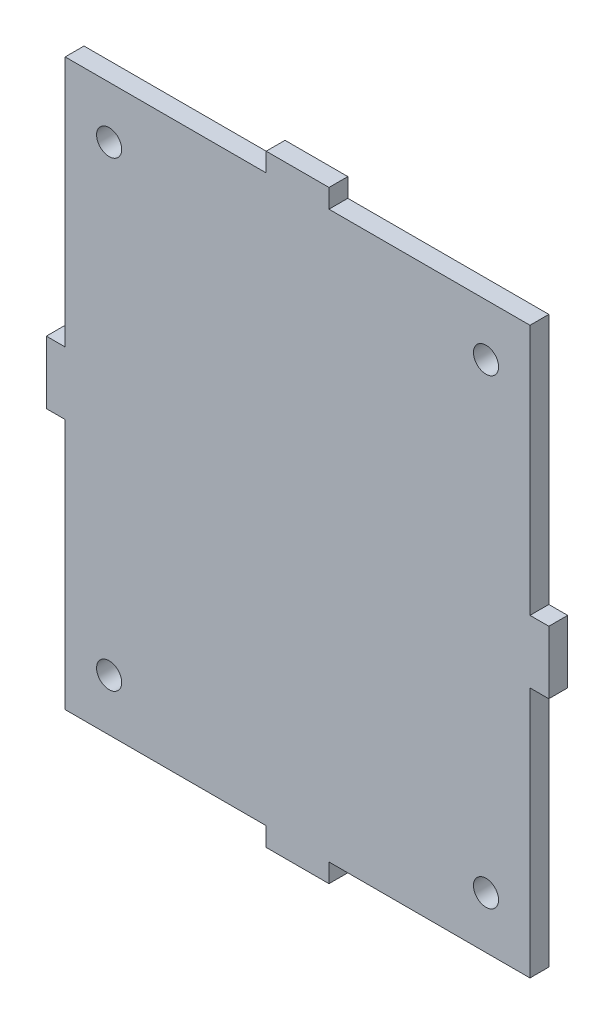
ISO-10303-21;
HEADER;
FILE_DESCRIPTION(('STEP AP214'),'2;1');
FILE_NAME('part.step','',(''),(''),'','','');
FILE_SCHEMA(('AUTOMOTIVE_DESIGN { 1 0 10303 214 1 1 1 1 }'));
ENDSEC;
DATA;
#1=APPLICATION_CONTEXT('core data for automotive mechanical design processes');
#2=APPLICATION_PROTOCOL_DEFINITION('international standard','automotive_design',2000,#1);
#3=PRODUCT_CONTEXT('',#1,'mechanical');
#4=PRODUCT('Part','Part','',(#3));
#5=PRODUCT_RELATED_PRODUCT_CATEGORY('part','',(#4));
#6=PRODUCT_DEFINITION_FORMATION('','',#4);
#7=PRODUCT_DEFINITION_CONTEXT('part definition',#1,'design');
#8=PRODUCT_DEFINITION('design','',#6,#7);
#9=PRODUCT_DEFINITION_SHAPE('','',#8);
#10=(LENGTH_UNIT() NAMED_UNIT(*) SI_UNIT(.MILLI.,.METRE.));
#11=(NAMED_UNIT(*) PLANE_ANGLE_UNIT() SI_UNIT($,.RADIAN.));
#12=(NAMED_UNIT(*) SI_UNIT($,.STERADIAN.) SOLID_ANGLE_UNIT());
#13=UNCERTAINTY_MEASURE_WITH_UNIT(LENGTH_MEASURE(1.E-05),#10,'distance_accuracy_value','');
#14=(GEOMETRIC_REPRESENTATION_CONTEXT(3) GLOBAL_UNCERTAINTY_ASSIGNED_CONTEXT((#13)) GLOBAL_UNIT_ASSIGNED_CONTEXT((#10,
#11,#12)) REPRESENTATION_CONTEXT('',''));
#15=CARTESIAN_POINT('',(0.,0.,0.));
#16=DIRECTION('',(0.,0.,1.));
#17=DIRECTION('',(1.,0.,0.));
#18=AXIS2_PLACEMENT_3D('',#15,#16,#17);
#19=CARTESIAN_POINT('',(-37.,-41.75,3.));
#20=DIRECTION('',(1.,0.,0.));
#21=DIRECTION('',(0.,0.,-1.));
#22=AXIS2_PLACEMENT_3D('',#19,#20,#21);
#23=PLANE('',#22);
#24=DIRECTION('',(0.,0.,1.));
#25=VECTOR('',#24,1.);
#26=CARTESIAN_POINT('',(-36.9999999999999,-41.75,-10.4403065089106));
#27=LINE('',#26,#25);
#28=CARTESIAN_POINT('',(-36.9999999999999,-41.75,0.));
#29=VERTEX_POINT('',#28);
#30=CARTESIAN_POINT('',(-36.9999999999999,-41.75,3.));
#31=VERTEX_POINT('',#30);
#32=EDGE_CURVE('E179',#29,#31,#27,.T.);
#33=ORIENTED_EDGE('',*,*,#32,.F.);
#34=DIRECTION('',(0.,-1.,0.));
#35=VECTOR('',#34,1.);
#36=CARTESIAN_POINT('',(-37.,-41.75,0.));
#37=LINE('',#36,#35);
#38=CARTESIAN_POINT('',(-37.,-81.75,0.));
#39=VERTEX_POINT('',#38);
#40=EDGE_CURVE('E189',#29,#39,#37,.T.);
#41=ORIENTED_EDGE('',*,*,#40,.T.);
#42=DIRECTION('',(0.,0.,-1.));
#43=VECTOR('',#42,1.);
#44=CARTESIAN_POINT('',(-37.,-81.75,3.));
#45=LINE('',#44,#43);
#46=CARTESIAN_POINT('',(-37.,-81.75,3.));
#47=VERTEX_POINT('',#46);
#48=EDGE_CURVE('E11',#47,#39,#45,.T.);
#49=ORIENTED_EDGE('',*,*,#48,.F.);
#50=DIRECTION('',(0.,-1.,0.));
#51=VECTOR('',#50,1.);
#52=CARTESIAN_POINT('',(-37.,-41.75,3.));
#53=LINE('',#52,#51);
#54=EDGE_CURVE('E190',#31,#47,#53,.T.);
#55=ORIENTED_EDGE('',*,*,#54,.F.);
#56=EDGE_LOOP('',(#33,#41,#49,#55));
#57=FACE_BOUND('',#56,.T.);
#58=ADVANCED_FACE('F37',(#57),#23,.F.);
#59=CARTESIAN_POINT('',(37.,-41.75,3.));
#60=DIRECTION('',(-1.,0.,0.));
#61=DIRECTION('',(0.,0.,1.));
#62=AXIS2_PLACEMENT_3D('',#59,#60,#61);
#63=PLANE('',#62);
#64=DIRECTION('',(0.,0.,1.));
#65=VECTOR('',#64,1.);
#66=CARTESIAN_POINT('',(36.9999999999999,-31.75,-10.4403065089106));
#67=LINE('',#66,#65);
#68=CARTESIAN_POINT('',(36.9999999999999,-31.75,0.));
#69=VERTEX_POINT('',#68);
#70=CARTESIAN_POINT('',(36.9999999999999,-31.75,3.));
#71=VERTEX_POINT('',#70);
#72=EDGE_CURVE('E332',#69,#71,#67,.T.);
#73=ORIENTED_EDGE('',*,*,#72,.F.);
#74=DIRECTION('',(0.,1.,0.));
#75=VECTOR('',#74,1.);
#76=CARTESIAN_POINT('',(37.,-41.75,0.));
#77=LINE('',#76,#75);
#78=CARTESIAN_POINT('',(37.,8.24999999999999,0.));
#79=VERTEX_POINT('',#78);
#80=EDGE_CURVE('E216',#69,#79,#77,.T.);
#81=ORIENTED_EDGE('',*,*,#80,.T.);
#82=DIRECTION('',(0.,0.,-1.));
#83=VECTOR('',#82,1.);
#84=CARTESIAN_POINT('',(37.,8.24999999999999,3.));
#85=LINE('',#84,#83);
#86=CARTESIAN_POINT('',(37.,8.24999999999999,3.));
#87=VERTEX_POINT('',#86);
#88=EDGE_CURVE('E45',#87,#79,#85,.T.);
#89=ORIENTED_EDGE('',*,*,#88,.F.);
#90=DIRECTION('',(0.,1.,0.));
#91=VECTOR('',#90,1.);
#92=CARTESIAN_POINT('',(37.,-41.75,3.));
#93=LINE('',#92,#91);
#94=EDGE_CURVE('E286',#71,#87,#93,.T.);
#95=ORIENTED_EDGE('',*,*,#94,.F.);
#96=EDGE_LOOP('',(#73,#81,#89,#95));
#97=FACE_BOUND('',#96,.T.);
#98=ADVANCED_FACE('F418',(#97),#63,.F.);
#99=CARTESIAN_POINT('',(0.,0.,3.));
#100=DIRECTION('',(0.,0.,-1.));
#101=DIRECTION('',(-1.,0.,0.));
#102=AXIS2_PLACEMENT_3D('',#99,#100,#101);
#103=PLANE('',#102);
#104=DIRECTION('',(1.,0.,0.));
#105=VECTOR('',#104,1.);
#106=CARTESIAN_POINT('',(5.,-81.75,3.));
#107=LINE('',#106,#105);
#108=CARTESIAN_POINT('',(5.,-81.75,3.));
#109=VERTEX_POINT('',#108);
#110=CARTESIAN_POINT('',(37.,-81.75,3.));
#111=VERTEX_POINT('',#110);
#112=EDGE_CURVE('E287',#109,#111,#107,.T.);
#113=ORIENTED_EDGE('',*,*,#112,.T.);
#114=CARTESIAN_POINT('',(37.,-41.75,3.));
#115=VERTEX_POINT('',#114);
#116=EDGE_CURVE('E283',#111,#115,#93,.T.);
#117=ORIENTED_EDGE('',*,*,#116,.T.);
#118=DIRECTION('',(1.,0.,0.));
#119=VECTOR('',#118,1.);
#120=CARTESIAN_POINT('',(39.9999999999999,-41.75,3.));
#121=LINE('',#120,#119);
#122=CARTESIAN_POINT('',(39.9999999999999,-41.75,3.));
#123=VERTEX_POINT('',#122);
#124=EDGE_CURVE('E60',#115,#123,#121,.T.);
#125=ORIENTED_EDGE('',*,*,#124,.T.);
#126=DIRECTION('',(0.,1.,0.));
#127=VECTOR('',#126,1.);
#128=CARTESIAN_POINT('',(39.9999999999999,-31.75,3.));
#129=LINE('',#128,#127);
#130=CARTESIAN_POINT('',(39.9999999999999,-31.75,3.));
#131=VERTEX_POINT('',#130);
#132=EDGE_CURVE('E338',#123,#131,#129,.T.);
#133=ORIENTED_EDGE('',*,*,#132,.T.);
#134=DIRECTION('',(-1.,0.,0.));
#135=VECTOR('',#134,1.);
#136=CARTESIAN_POINT('',(39.9999999999999,-31.75,3.));
#137=LINE('',#136,#135);
#138=EDGE_CURVE('E349',#131,#71,#137,.T.);
#139=ORIENTED_EDGE('',*,*,#138,.T.);
#140=ORIENTED_EDGE('',*,*,#94,.T.);
#141=DIRECTION('',(-1.,0.,0.));
#142=VECTOR('',#141,1.);
#143=CARTESIAN_POINT('',(5.,8.24999999999999,3.));
#144=LINE('',#143,#142);
#145=CARTESIAN_POINT('',(5.,8.24999999999999,3.));
#146=VERTEX_POINT('',#145);
#147=EDGE_CURVE('E260',#87,#146,#144,.T.);
#148=ORIENTED_EDGE('',*,*,#147,.T.);
#149=DIRECTION('',(0.,1.,0.));
#150=VECTOR('',#149,1.);
#151=CARTESIAN_POINT('',(5.,11.25,3.));
#152=LINE('',#151,#150);
#153=CARTESIAN_POINT('',(5.,11.25,3.));
#154=VERTEX_POINT('',#153);
#155=EDGE_CURVE('E278',#146,#154,#152,.T.);
#156=ORIENTED_EDGE('',*,*,#155,.T.);
#157=DIRECTION('',(-1.,0.,0.));
#158=VECTOR('',#157,1.);
#159=CARTESIAN_POINT('',(-5.,11.25,3.));
#160=LINE('',#159,#158);
#161=CARTESIAN_POINT('',(-5.,11.25,3.));
#162=VERTEX_POINT('',#161);
#163=EDGE_CURVE('E275',#154,#162,#160,.T.);
#164=ORIENTED_EDGE('',*,*,#163,.T.);
#165=DIRECTION('',(0.,-1.,0.));
#166=VECTOR('',#165,1.);
#167=CARTESIAN_POINT('',(-5.,11.25,3.));
#168=LINE('',#167,#166);
#169=CARTESIAN_POINT('',(-5.,8.24999999999999,3.));
#170=VERTEX_POINT('',#169);
#171=EDGE_CURVE('E233',#162,#170,#168,.T.);
#172=ORIENTED_EDGE('',*,*,#171,.T.);
#173=DIRECTION('',(-1.,0.,0.));
#174=VECTOR('',#173,1.);
#175=CARTESIAN_POINT('',(-40.,8.24999999999999,3.));
#176=LINE('',#175,#174);
#177=CARTESIAN_POINT('',(-37.,8.24999999999999,3.));
#178=VERTEX_POINT('',#177);
#179=EDGE_CURVE('E228',#170,#178,#176,.T.);
#180=ORIENTED_EDGE('',*,*,#179,.T.);
#181=CARTESIAN_POINT('',(-37.,-31.75,3.));
#182=VERTEX_POINT('',#181);
#183=EDGE_CURVE('E298',#178,#182,#53,.T.);
#184=ORIENTED_EDGE('',*,*,#183,.T.);
#185=DIRECTION('',(-1.,0.,0.));
#186=VECTOR('',#185,1.);
#187=CARTESIAN_POINT('',(-39.9999999999999,-31.75,3.));
#188=LINE('',#187,#186);
#189=CARTESIAN_POINT('',(-39.9999999999999,-31.75,3.));
#190=VERTEX_POINT('',#189);
#191=EDGE_CURVE('E52',#182,#190,#188,.T.);
#192=ORIENTED_EDGE('',*,*,#191,.T.);
#193=DIRECTION('',(0.,-1.,0.));
#194=VECTOR('',#193,1.);
#195=CARTESIAN_POINT('',(-39.9999999999999,-31.75,3.));
#196=LINE('',#195,#194);
#197=CARTESIAN_POINT('',(-39.9999999999999,-41.75,3.));
#198=VERTEX_POINT('',#197);
#199=EDGE_CURVE('E356',#190,#198,#196,.T.);
#200=ORIENTED_EDGE('',*,*,#199,.T.);
#201=DIRECTION('',(1.,0.,0.));
#202=VECTOR('',#201,1.);
#203=CARTESIAN_POINT('',(-39.9999999999999,-41.75,3.));
#204=LINE('',#203,#202);
#205=EDGE_CURVE('E352',#198,#31,#204,.T.);
#206=ORIENTED_EDGE('',*,*,#205,.T.);
#207=ORIENTED_EDGE('',*,*,#54,.T.);
#208=DIRECTION('',(1.,0.,0.));
#209=VECTOR('',#208,1.);
#210=CARTESIAN_POINT('',(-40.,-81.75,3.));
#211=LINE('',#210,#209);
#212=CARTESIAN_POINT('',(-5.,-81.75,3.));
#213=VERTEX_POINT('',#212);
#214=EDGE_CURVE('E296',#47,#213,#211,.T.);
#215=ORIENTED_EDGE('',*,*,#214,.T.);
#216=DIRECTION('',(0.,-1.,0.));
#217=VECTOR('',#216,1.);
#218=CARTESIAN_POINT('',(-5.,-84.75,3.));
#219=LINE('',#218,#217);
#220=CARTESIAN_POINT('',(-5.,-84.75,3.));
#221=VERTEX_POINT('',#220);
#222=EDGE_CURVE('E294',#213,#221,#219,.T.);
#223=ORIENTED_EDGE('',*,*,#222,.T.);
#224=DIRECTION('',(1.,0.,0.));
#225=VECTOR('',#224,1.);
#226=CARTESIAN_POINT('',(-5.,-84.75,3.));
#227=LINE('',#226,#225);
#228=CARTESIAN_POINT('',(5.,-84.75,3.));
#229=VERTEX_POINT('',#228);
#230=EDGE_CURVE('E292',#221,#229,#227,.T.);
#231=ORIENTED_EDGE('',*,*,#230,.T.);
#232=DIRECTION('',(0.,1.,0.));
#233=VECTOR('',#232,1.);
#234=CARTESIAN_POINT('',(5.,-84.75,3.));
#235=LINE('',#234,#233);
#236=EDGE_CURVE('E290',#229,#109,#235,.T.);
#237=ORIENTED_EDGE('',*,*,#236,.T.);
#238=EDGE_LOOP('',(#113,#117,#125,#133,#139,#140,#148,#156,#164,#172,#180,#184,#192,#200,#206,
#207,#215,#223,#231,#237));
#239=FACE_BOUND('',#238,.T.);
#240=CARTESIAN_POINT('',(30.,0.,3.));
#241=DIRECTION('',(0.,0.,1.));
#242=DIRECTION('',(1.,0.,0.));
#243=AXIS2_PLACEMENT_3D('',#240,#241,#242);
#244=CIRCLE('',#243,2.);
#245=CARTESIAN_POINT('',(32.,0.,3.));
#246=VERTEX_POINT('',#245);
#247=EDGE_CURVE('E202',#246,#246,#244,.T.);
#248=ORIENTED_EDGE('',*,*,#247,.F.);
#249=EDGE_LOOP('',(#248));
#250=FACE_BOUND('',#249,.T.);
#251=CARTESIAN_POINT('',(30.,-73.5,3.));
#252=DIRECTION('',(0.,0.,1.));
#253=DIRECTION('',(-1.,0.,0.));
#254=AXIS2_PLACEMENT_3D('',#251,#252,#253);
#255=CIRCLE('',#254,2.);
#256=CARTESIAN_POINT('',(28.,-73.5,3.));
#257=VERTEX_POINT('',#256);
#258=EDGE_CURVE('E306',#257,#257,#255,.T.);
#259=ORIENTED_EDGE('',*,*,#258,.F.);
#260=EDGE_LOOP('',(#259));
#261=FACE_BOUND('',#260,.T.);
#262=CARTESIAN_POINT('',(-30.,-73.5,3.));
#263=DIRECTION('',(0.,0.,1.));
#264=DIRECTION('',(1.,0.,0.));
#265=AXIS2_PLACEMENT_3D('',#262,#263,#264);
#266=CIRCLE('',#265,2.);
#267=CARTESIAN_POINT('',(-28.,-73.5,3.));
#268=VERTEX_POINT('',#267);
#269=EDGE_CURVE('E312',#268,#268,#266,.T.);
#270=ORIENTED_EDGE('',*,*,#269,.F.);
#271=EDGE_LOOP('',(#270));
#272=FACE_BOUND('',#271,.T.);
#273=CARTESIAN_POINT('',(-30.,0.,3.));
#274=DIRECTION('',(0.,0.,1.));
#275=DIRECTION('',(-1.,0.,0.));
#276=AXIS2_PLACEMENT_3D('',#273,#274,#275);
#277=CIRCLE('',#276,2.);
#278=CARTESIAN_POINT('',(-32.,0.,3.));
#279=VERTEX_POINT('',#278);
#280=EDGE_CURVE('E318',#279,#279,#277,.T.);
#281=ORIENTED_EDGE('',*,*,#280,.F.);
#282=EDGE_LOOP('',(#281));
#283=FACE_BOUND('',#282,.T.);
#284=ADVANCED_FACE('F373',(#239,#250,#261,#272,#283),#103,.F.);
#285=CARTESIAN_POINT('',(0.,0.,0.));
#286=DIRECTION('',(0.,0.,-1.));
#287=DIRECTION('',(-1.,0.,0.));
#288=AXIS2_PLACEMENT_3D('',#285,#286,#287);
#289=PLANE('',#288);
#290=CARTESIAN_POINT('',(37.,-81.75,0.));
#291=VERTEX_POINT('',#290);
#292=CARTESIAN_POINT('',(36.9999999999999,-41.75,0.));
#293=VERTEX_POINT('',#292);
#294=EDGE_CURVE('E217',#291,#293,#77,.T.);
#295=ORIENTED_EDGE('',*,*,#294,.F.);
#296=DIRECTION('',(1.,0.,0.));
#297=VECTOR('',#296,1.);
#298=CARTESIAN_POINT('',(5.,-81.75,0.));
#299=LINE('',#298,#297);
#300=CARTESIAN_POINT('',(5.,-81.75,0.));
#301=VERTEX_POINT('',#300);
#302=EDGE_CURVE('E213',#301,#291,#299,.T.);
#303=ORIENTED_EDGE('',*,*,#302,.F.);
#304=DIRECTION('',(0.,1.,0.));
#305=VECTOR('',#304,1.);
#306=CARTESIAN_POINT('',(5.,-84.75,0.));
#307=LINE('',#306,#305);
#308=CARTESIAN_POINT('',(5.,-84.75,0.));
#309=VERTEX_POINT('',#308);
#310=EDGE_CURVE('E211',#309,#301,#307,.T.);
#311=ORIENTED_EDGE('',*,*,#310,.F.);
#312=DIRECTION('',(1.,0.,0.));
#313=VECTOR('',#312,1.);
#314=CARTESIAN_POINT('',(-5.,-84.75,0.));
#315=LINE('',#314,#313);
#316=CARTESIAN_POINT('',(-5.,-84.75,0.));
#317=VERTEX_POINT('',#316);
#318=EDGE_CURVE('E209',#317,#309,#315,.T.);
#319=ORIENTED_EDGE('',*,*,#318,.F.);
#320=DIRECTION('',(0.,-1.,0.));
#321=VECTOR('',#320,1.);
#322=CARTESIAN_POINT('',(-5.,-84.75,0.));
#323=LINE('',#322,#321);
#324=CARTESIAN_POINT('',(-5.,-81.75,0.));
#325=VERTEX_POINT('',#324);
#326=EDGE_CURVE('E207',#325,#317,#323,.T.);
#327=ORIENTED_EDGE('',*,*,#326,.F.);
#328=DIRECTION('',(1.,0.,0.));
#329=VECTOR('',#328,1.);
#330=CARTESIAN_POINT('',(-40.,-81.75,0.));
#331=LINE('',#330,#329);
#332=EDGE_CURVE('E196',#39,#325,#331,.T.);
#333=ORIENTED_EDGE('',*,*,#332,.F.);
#334=ORIENTED_EDGE('',*,*,#40,.F.);
#335=DIRECTION('',(1.,0.,0.));
#336=VECTOR('',#335,1.);
#337=CARTESIAN_POINT('',(-39.9999999999999,-41.75,0.));
#338=LINE('',#337,#336);
#339=CARTESIAN_POINT('',(-39.9999999999999,-41.75,0.));
#340=VERTEX_POINT('',#339);
#341=EDGE_CURVE('E175',#340,#29,#338,.T.);
#342=ORIENTED_EDGE('',*,*,#341,.F.);
#343=DIRECTION('',(0.,-1.,0.));
#344=VECTOR('',#343,1.);
#345=CARTESIAN_POINT('',(-39.9999999999999,-31.75,0.));
#346=LINE('',#345,#344);
#347=CARTESIAN_POINT('',(-39.9999999999999,-31.75,0.));
#348=VERTEX_POINT('',#347);
#349=EDGE_CURVE('E362',#348,#340,#346,.T.);
#350=ORIENTED_EDGE('',*,*,#349,.F.);
#351=DIRECTION('',(-1.,0.,0.));
#352=VECTOR('',#351,1.);
#353=CARTESIAN_POINT('',(-39.9999999999999,-31.75,0.));
#354=LINE('',#353,#352);
#355=CARTESIAN_POINT('',(-36.9999999999999,-31.75,0.));
#356=VERTEX_POINT('',#355);
#357=EDGE_CURVE('E365',#356,#348,#354,.T.);
#358=ORIENTED_EDGE('',*,*,#357,.F.);
#359=CARTESIAN_POINT('',(-37.,8.24999999999999,0.));
#360=VERTEX_POINT('',#359);
#361=EDGE_CURVE('E197',#360,#356,#37,.T.);
#362=ORIENTED_EDGE('',*,*,#361,.F.);
#363=DIRECTION('',(-1.,0.,0.));
#364=VECTOR('',#363,1.);
#365=CARTESIAN_POINT('',(-40.,8.24999999999999,0.));
#366=LINE('',#365,#364);
#367=CARTESIAN_POINT('',(-5.,8.24999999999999,0.));
#368=VERTEX_POINT('',#367);
#369=EDGE_CURVE('E198',#368,#360,#366,.T.);
#370=ORIENTED_EDGE('',*,*,#369,.F.);
#371=DIRECTION('',(0.,-1.,0.));
#372=VECTOR('',#371,1.);
#373=CARTESIAN_POINT('',(-5.,11.25,0.));
#374=LINE('',#373,#372);
#375=CARTESIAN_POINT('',(-5.,11.25,0.));
#376=VERTEX_POINT('',#375);
#377=EDGE_CURVE('E226',#376,#368,#374,.T.);
#378=ORIENTED_EDGE('',*,*,#377,.F.);
#379=DIRECTION('',(-1.,0.,0.));
#380=VECTOR('',#379,1.);
#381=CARTESIAN_POINT('',(-5.,11.25,0.));
#382=LINE('',#381,#380);
#383=CARTESIAN_POINT('',(5.,11.25,0.));
#384=VERTEX_POINT('',#383);
#385=EDGE_CURVE('E224',#384,#376,#382,.T.);
#386=ORIENTED_EDGE('',*,*,#385,.F.);
#387=DIRECTION('',(0.,1.,0.));
#388=VECTOR('',#387,1.);
#389=CARTESIAN_POINT('',(5.,11.25,0.));
#390=LINE('',#389,#388);
#391=CARTESIAN_POINT('',(5.,8.24999999999999,0.));
#392=VERTEX_POINT('',#391);
#393=EDGE_CURVE('E222',#392,#384,#390,.T.);
#394=ORIENTED_EDGE('',*,*,#393,.F.);
#395=DIRECTION('',(-1.,0.,0.));
#396=VECTOR('',#395,1.);
#397=CARTESIAN_POINT('',(5.,8.24999999999999,0.));
#398=LINE('',#397,#396);
#399=EDGE_CURVE('E220',#79,#392,#398,.T.);
#400=ORIENTED_EDGE('',*,*,#399,.F.);
#401=ORIENTED_EDGE('',*,*,#80,.F.);
#402=DIRECTION('',(-1.,0.,0.));
#403=VECTOR('',#402,1.);
#404=CARTESIAN_POINT('',(39.9999999999999,-31.75,0.));
#405=LINE('',#404,#403);
#406=CARTESIAN_POINT('',(39.9999999999999,-31.75,0.));
#407=VERTEX_POINT('',#406);
#408=EDGE_CURVE('E334',#407,#69,#405,.T.);
#409=ORIENTED_EDGE('',*,*,#408,.F.);
#410=DIRECTION('',(0.,1.,0.));
#411=VECTOR('',#410,1.);
#412=CARTESIAN_POINT('',(39.9999999999999,-31.75,0.));
#413=LINE('',#412,#411);
#414=CARTESIAN_POINT('',(39.9999999999999,-41.75,0.));
#415=VERTEX_POINT('',#414);
#416=EDGE_CURVE('E341',#415,#407,#413,.T.);
#417=ORIENTED_EDGE('',*,*,#416,.F.);
#418=DIRECTION('',(1.,0.,0.));
#419=VECTOR('',#418,1.);
#420=CARTESIAN_POINT('',(39.9999999999999,-41.75,0.));
#421=LINE('',#420,#419);
#422=EDGE_CURVE('E337',#293,#415,#421,.T.);
#423=ORIENTED_EDGE('',*,*,#422,.F.);
#424=EDGE_LOOP('',(#295,#303,#311,#319,#327,#333,#334,#342,#350,#358,#362,#370,#378,#386,#394,
#400,#401,#409,#417,#423));
#425=FACE_BOUND('',#424,.T.);
#426=CARTESIAN_POINT('',(-30.,-73.5,0.));
#427=DIRECTION('',(0.,0.,1.));
#428=DIRECTION('',(1.,0.,0.));
#429=AXIS2_PLACEMENT_3D('',#426,#427,#428);
#430=CIRCLE('',#429,2.);
#431=CARTESIAN_POINT('',(-28.,-73.5,0.));
#432=VERTEX_POINT('',#431);
#433=EDGE_CURVE('E315',#432,#432,#430,.T.);
#434=ORIENTED_EDGE('',*,*,#433,.T.);
#435=EDGE_LOOP('',(#434));
#436=FACE_BOUND('',#435,.T.);
#437=CARTESIAN_POINT('',(30.,0.,0.));
#438=DIRECTION('',(0.,0.,1.));
#439=DIRECTION('',(1.,0.,0.));
#440=AXIS2_PLACEMENT_3D('',#437,#438,#439);
#441=CIRCLE('',#440,2.);
#442=CARTESIAN_POINT('',(32.,0.,0.));
#443=VERTEX_POINT('',#442);
#444=EDGE_CURVE('E303',#443,#443,#441,.T.);
#445=ORIENTED_EDGE('',*,*,#444,.T.);
#446=EDGE_LOOP('',(#445));
#447=FACE_BOUND('',#446,.T.);
#448=CARTESIAN_POINT('',(30.,-73.5,0.));
#449=DIRECTION('',(0.,0.,1.));
#450=DIRECTION('',(-1.,0.,0.));
#451=AXIS2_PLACEMENT_3D('',#448,#449,#450);
#452=CIRCLE('',#451,2.);
#453=CARTESIAN_POINT('',(28.,-73.5,0.));
#454=VERTEX_POINT('',#453);
#455=EDGE_CURVE('E309',#454,#454,#452,.T.);
#456=ORIENTED_EDGE('',*,*,#455,.T.);
#457=EDGE_LOOP('',(#456));
#458=FACE_BOUND('',#457,.T.);
#459=CARTESIAN_POINT('',(-30.,0.,0.));
#460=DIRECTION('',(0.,0.,1.));
#461=DIRECTION('',(-1.,0.,0.));
#462=AXIS2_PLACEMENT_3D('',#459,#460,#461);
#463=CIRCLE('',#462,2.);
#464=CARTESIAN_POINT('',(-32.,0.,0.));
#465=VERTEX_POINT('',#464);
#466=EDGE_CURVE('E321',#465,#465,#463,.T.);
#467=ORIENTED_EDGE('',*,*,#466,.T.);
#468=EDGE_LOOP('',(#467));
#469=FACE_BOUND('',#468,.T.);
#470=ADVANCED_FACE('F193',(#425,#436,#447,#458,#469),#289,.T.);
#471=CARTESIAN_POINT('',(-40.,8.24999999999999,3.));
#472=DIRECTION('',(0.,-1.,0.));
#473=DIRECTION('',(0.,0.,-1.));
#474=AXIS2_PLACEMENT_3D('',#471,#472,#473);
#475=PLANE('',#474);
#476=ORIENTED_EDGE('',*,*,#369,.T.);
#477=DIRECTION('',(0.,0.,1.));
#478=VECTOR('',#477,1.);
#479=CARTESIAN_POINT('',(-37.,8.24999999999999,3.));
#480=LINE('',#479,#478);
#481=EDGE_CURVE('E324',#360,#178,#480,.T.);
#482=ORIENTED_EDGE('',*,*,#481,.T.);
#483=ORIENTED_EDGE('',*,*,#179,.F.);
#484=DIRECTION('',(0.,0.,-1.));
#485=VECTOR('',#484,1.);
#486=CARTESIAN_POINT('',(-5.,8.24999999999999,3.));
#487=LINE('',#486,#485);
#488=EDGE_CURVE('E229',#170,#368,#487,.T.);
#489=ORIENTED_EDGE('',*,*,#488,.T.);
#490=EDGE_LOOP('',(#476,#482,#483,#489));
#491=FACE_BOUND('',#490,.T.);
#492=ADVANCED_FACE('F39',(#491),#475,.F.);
#493=ORIENTED_EDGE('',*,*,#361,.T.);
#494=DIRECTION('',(0.,0.,1.));
#495=VECTOR('',#494,1.);
#496=CARTESIAN_POINT('',(-36.9999999999999,-31.75,-10.4403065089106));
#497=LINE('',#496,#495);
#498=EDGE_CURVE('E359',#356,#182,#497,.T.);
#499=ORIENTED_EDGE('',*,*,#498,.T.);
#500=ORIENTED_EDGE('',*,*,#183,.F.);
#501=ORIENTED_EDGE('',*,*,#481,.F.);
#502=EDGE_LOOP('',(#493,#499,#500,#501));
#503=FACE_BOUND('',#502,.T.);
#504=ADVANCED_FACE('F371',(#503),#23,.F.);
#505=CARTESIAN_POINT('',(-40.,-81.75,3.));
#506=DIRECTION('',(0.,1.,0.));
#507=DIRECTION('',(-1.,0.,0.));
#508=AXIS2_PLACEMENT_3D('',#505,#506,#507);
#509=PLANE('',#508);
#510=ORIENTED_EDGE('',*,*,#214,.F.);
#511=ORIENTED_EDGE('',*,*,#48,.T.);
#512=ORIENTED_EDGE('',*,*,#332,.T.);
#513=DIRECTION('',(0.,0.,-1.));
#514=VECTOR('',#513,1.);
#515=CARTESIAN_POINT('',(-5.,-81.75,3.));
#516=LINE('',#515,#514);
#517=EDGE_CURVE('E251',#213,#325,#516,.T.);
#518=ORIENTED_EDGE('',*,*,#517,.F.);
#519=EDGE_LOOP('',(#510,#511,#512,#518));
#520=FACE_BOUND('',#519,.T.);
#521=ADVANCED_FACE('F387',(#520),#509,.F.);
#522=CARTESIAN_POINT('',(-5.,-84.75,3.));
#523=DIRECTION('',(1.,0.,0.));
#524=DIRECTION('',(0.,1.,0.));
#525=AXIS2_PLACEMENT_3D('',#522,#523,#524);
#526=PLANE('',#525);
#527=ORIENTED_EDGE('',*,*,#326,.T.);
#528=DIRECTION('',(0.,0.,-1.));
#529=VECTOR('',#528,1.);
#530=CARTESIAN_POINT('',(-5.,-84.75,3.));
#531=LINE('',#530,#529);
#532=EDGE_CURVE('E248',#221,#317,#531,.T.);
#533=ORIENTED_EDGE('',*,*,#532,.F.);
#534=ORIENTED_EDGE('',*,*,#222,.F.);
#535=ORIENTED_EDGE('',*,*,#517,.T.);
#536=EDGE_LOOP('',(#527,#533,#534,#535));
#537=FACE_BOUND('',#536,.T.);
#538=ADVANCED_FACE('F391',(#537),#526,.F.);
#539=CARTESIAN_POINT('',(-5.,-84.75,3.));
#540=DIRECTION('',(0.,1.,0.));
#541=DIRECTION('',(-1.,0.,0.));
#542=AXIS2_PLACEMENT_3D('',#539,#540,#541);
#543=PLANE('',#542);
#544=ORIENTED_EDGE('',*,*,#318,.T.);
#545=DIRECTION('',(0.,0.,-1.));
#546=VECTOR('',#545,1.);
#547=CARTESIAN_POINT('',(5.,-84.75,3.));
#548=LINE('',#547,#546);
#549=EDGE_CURVE('E245',#229,#309,#548,.T.);
#550=ORIENTED_EDGE('',*,*,#549,.F.);
#551=ORIENTED_EDGE('',*,*,#230,.F.);
#552=ORIENTED_EDGE('',*,*,#532,.T.);
#553=EDGE_LOOP('',(#544,#550,#551,#552));
#554=FACE_BOUND('',#553,.T.);
#555=ADVANCED_FACE('F397',(#554),#543,.F.);
#556=CARTESIAN_POINT('',(5.,-84.75,3.));
#557=DIRECTION('',(-1.,0.,0.));
#558=DIRECTION('',(0.,-1.,0.));
#559=AXIS2_PLACEMENT_3D('',#556,#557,#558);
#560=PLANE('',#559);
#561=ORIENTED_EDGE('',*,*,#310,.T.);
#562=DIRECTION('',(0.,0.,-1.));
#563=VECTOR('',#562,1.);
#564=CARTESIAN_POINT('',(5.,-81.75,3.));
#565=LINE('',#564,#563);
#566=EDGE_CURVE('E242',#109,#301,#565,.T.);
#567=ORIENTED_EDGE('',*,*,#566,.F.);
#568=ORIENTED_EDGE('',*,*,#236,.F.);
#569=ORIENTED_EDGE('',*,*,#549,.T.);
#570=EDGE_LOOP('',(#561,#567,#568,#569));
#571=FACE_BOUND('',#570,.T.);
#572=ADVANCED_FACE('F401',(#571),#560,.F.);
#573=CARTESIAN_POINT('',(5.,-81.75,3.));
#574=DIRECTION('',(0.,1.,0.));
#575=DIRECTION('',(-1.,0.,0.));
#576=AXIS2_PLACEMENT_3D('',#573,#574,#575);
#577=PLANE('',#576);
#578=ORIENTED_EDGE('',*,*,#302,.T.);
#579=DIRECTION('',(0.,0.,1.));
#580=VECTOR('',#579,1.);
#581=CARTESIAN_POINT('',(37.,-81.75,3.));
#582=LINE('',#581,#580);
#583=EDGE_CURVE('E329',#291,#111,#582,.T.);
#584=ORIENTED_EDGE('',*,*,#583,.T.);
#585=ORIENTED_EDGE('',*,*,#112,.F.);
#586=ORIENTED_EDGE('',*,*,#566,.T.);
#587=EDGE_LOOP('',(#578,#584,#585,#586));
#588=FACE_BOUND('',#587,.T.);
#589=ADVANCED_FACE('F405',(#588),#577,.F.);
#590=ORIENTED_EDGE('',*,*,#294,.T.);
#591=DIRECTION('',(0.,0.,1.));
#592=VECTOR('',#591,1.);
#593=CARTESIAN_POINT('',(36.9999999999999,-41.75,-10.4403065089106));
#594=LINE('',#593,#592);
#595=EDGE_CURVE('E335',#293,#115,#594,.T.);
#596=ORIENTED_EDGE('',*,*,#595,.T.);
#597=ORIENTED_EDGE('',*,*,#116,.F.);
#598=ORIENTED_EDGE('',*,*,#583,.F.);
#599=EDGE_LOOP('',(#590,#596,#597,#598));
#600=FACE_BOUND('',#599,.T.);
#601=ADVANCED_FACE('F409',(#600),#63,.F.);
#602=CARTESIAN_POINT('',(5.,8.24999999999999,3.));
#603=DIRECTION('',(0.,-1.,0.));
#604=DIRECTION('',(0.,0.,-1.));
#605=AXIS2_PLACEMENT_3D('',#602,#603,#604);
#606=PLANE('',#605);
#607=ORIENTED_EDGE('',*,*,#147,.F.);
#608=ORIENTED_EDGE('',*,*,#88,.T.);
#609=ORIENTED_EDGE('',*,*,#399,.T.);
#610=DIRECTION('',(0.,0.,-1.));
#611=VECTOR('',#610,1.);
#612=CARTESIAN_POINT('',(5.,8.24999999999999,3.));
#613=LINE('',#612,#611);
#614=EDGE_CURVE('E239',#146,#392,#613,.T.);
#615=ORIENTED_EDGE('',*,*,#614,.F.);
#616=EDGE_LOOP('',(#607,#608,#609,#615));
#617=FACE_BOUND('',#616,.T.);
#618=ADVANCED_FACE('F258',(#617),#606,.F.);
#619=CARTESIAN_POINT('',(5.,11.25,3.));
#620=DIRECTION('',(-1.,0.,0.));
#621=DIRECTION('',(0.,-1.,0.));
#622=AXIS2_PLACEMENT_3D('',#619,#620,#621);
#623=PLANE('',#622);
#624=ORIENTED_EDGE('',*,*,#393,.T.);
#625=DIRECTION('',(0.,0.,-1.));
#626=VECTOR('',#625,1.);
#627=CARTESIAN_POINT('',(5.,11.25,3.));
#628=LINE('',#627,#626);
#629=EDGE_CURVE('E236',#154,#384,#628,.T.);
#630=ORIENTED_EDGE('',*,*,#629,.F.);
#631=ORIENTED_EDGE('',*,*,#155,.F.);
#632=ORIENTED_EDGE('',*,*,#614,.T.);
#633=EDGE_LOOP('',(#624,#630,#631,#632));
#634=FACE_BOUND('',#633,.T.);
#635=ADVANCED_FACE('F269',(#634),#623,.F.);
#636=CARTESIAN_POINT('',(-5.,11.25,3.));
#637=DIRECTION('',(0.,-1.,0.));
#638=DIRECTION('',(1.,0.,0.));
#639=AXIS2_PLACEMENT_3D('',#636,#637,#638);
#640=PLANE('',#639);
#641=ORIENTED_EDGE('',*,*,#385,.T.);
#642=DIRECTION('',(0.,0.,-1.));
#643=VECTOR('',#642,1.);
#644=CARTESIAN_POINT('',(-5.,11.25,3.));
#645=LINE('',#644,#643);
#646=EDGE_CURVE('E232',#162,#376,#645,.T.);
#647=ORIENTED_EDGE('',*,*,#646,.F.);
#648=ORIENTED_EDGE('',*,*,#163,.F.);
#649=ORIENTED_EDGE('',*,*,#629,.T.);
#650=EDGE_LOOP('',(#641,#647,#648,#649));
#651=FACE_BOUND('',#650,.T.);
#652=ADVANCED_FACE('F273',(#651),#640,.F.);
#653=CARTESIAN_POINT('',(-5.,11.25,3.));
#654=DIRECTION('',(1.,0.,0.));
#655=DIRECTION('',(0.,1.,0.));
#656=AXIS2_PLACEMENT_3D('',#653,#654,#655);
#657=PLANE('',#656);
#658=ORIENTED_EDGE('',*,*,#377,.T.);
#659=ORIENTED_EDGE('',*,*,#488,.F.);
#660=ORIENTED_EDGE('',*,*,#171,.F.);
#661=ORIENTED_EDGE('',*,*,#646,.T.);
#662=EDGE_LOOP('',(#658,#659,#660,#661));
#663=FACE_BOUND('',#662,.T.);
#664=ADVANCED_FACE('F453',(#663),#657,.F.);
#665=CARTESIAN_POINT('',(30.,0.,3.));
#666=DIRECTION('',(0.,0.,-1.));
#667=DIRECTION('',(-1.,0.,0.));
#668=AXIS2_PLACEMENT_3D('',#665,#666,#667);
#669=CYLINDRICAL_SURFACE('',#668,2.);
#670=ORIENTED_EDGE('',*,*,#247,.T.);
#671=EDGE_LOOP('',(#670));
#672=FACE_BOUND('',#671,.T.);
#673=ORIENTED_EDGE('',*,*,#444,.F.);
#674=EDGE_LOOP('',(#673));
#675=FACE_BOUND('',#674,.T.);
#676=ADVANCED_FACE('F456',(#672,#675),#669,.F.);
#677=CARTESIAN_POINT('',(30.,-73.5,3.));
#678=DIRECTION('',(0.,0.,-1.));
#679=DIRECTION('',(-1.,0.,0.));
#680=AXIS2_PLACEMENT_3D('',#677,#678,#679);
#681=CYLINDRICAL_SURFACE('',#680,2.);
#682=ORIENTED_EDGE('',*,*,#258,.T.);
#683=EDGE_LOOP('',(#682));
#684=FACE_BOUND('',#683,.T.);
#685=ORIENTED_EDGE('',*,*,#455,.F.);
#686=EDGE_LOOP('',(#685));
#687=FACE_BOUND('',#686,.T.);
#688=ADVANCED_FACE('F517',(#684,#687),#681,.F.);
#689=CARTESIAN_POINT('',(-30.,-73.5,3.));
#690=DIRECTION('',(0.,0.,-1.));
#691=DIRECTION('',(-1.,0.,0.));
#692=AXIS2_PLACEMENT_3D('',#689,#690,#691);
#693=CYLINDRICAL_SURFACE('',#692,2.);
#694=ORIENTED_EDGE('',*,*,#269,.T.);
#695=EDGE_LOOP('',(#694));
#696=FACE_BOUND('',#695,.T.);
#697=ORIENTED_EDGE('',*,*,#433,.F.);
#698=EDGE_LOOP('',(#697));
#699=FACE_BOUND('',#698,.T.);
#700=ADVANCED_FACE('F524',(#696,#699),#693,.F.);
#701=CARTESIAN_POINT('',(-30.,0.,3.));
#702=DIRECTION('',(0.,0.,-1.));
#703=DIRECTION('',(-1.,0.,0.));
#704=AXIS2_PLACEMENT_3D('',#701,#702,#703);
#705=CYLINDRICAL_SURFACE('',#704,2.);
#706=ORIENTED_EDGE('',*,*,#280,.T.);
#707=EDGE_LOOP('',(#706));
#708=FACE_BOUND('',#707,.T.);
#709=ORIENTED_EDGE('',*,*,#466,.F.);
#710=EDGE_LOOP('',(#709));
#711=FACE_BOUND('',#710,.T.);
#712=ADVANCED_FACE('F531',(#708,#711),#705,.F.);
#713=CARTESIAN_POINT('',(39.9999999999999,-41.75,-10.4403065089106));
#714=DIRECTION('',(0.,-1.,0.));
#715=DIRECTION('',(0.,0.,-1.));
#716=AXIS2_PLACEMENT_3D('',#713,#714,#715);
#717=PLANE('',#716);
#718=ORIENTED_EDGE('',*,*,#595,.F.);
#719=ORIENTED_EDGE('',*,*,#422,.T.);
#720=DIRECTION('',(0.,0.,1.));
#721=VECTOR('',#720,1.);
#722=CARTESIAN_POINT('',(39.9999999999999,-41.75,-10.4403065089106));
#723=LINE('',#722,#721);
#724=EDGE_CURVE('E339',#415,#123,#723,.T.);
#725=ORIENTED_EDGE('',*,*,#724,.T.);
#726=ORIENTED_EDGE('',*,*,#124,.F.);
#727=EDGE_LOOP('',(#718,#719,#725,#726));
#728=FACE_BOUND('',#727,.T.);
#729=ADVANCED_FACE('F410',(#728),#717,.T.);
#730=CARTESIAN_POINT('',(39.9999999999999,-31.75,-10.4403065089106));
#731=DIRECTION('',(1.,0.,0.));
#732=DIRECTION('',(0.,0.,-1.));
#733=AXIS2_PLACEMENT_3D('',#730,#731,#732);
#734=PLANE('',#733);
#735=ORIENTED_EDGE('',*,*,#724,.F.);
#736=ORIENTED_EDGE('',*,*,#416,.T.);
#737=DIRECTION('',(0.,0.,1.));
#738=VECTOR('',#737,1.);
#739=CARTESIAN_POINT('',(39.9999999999999,-31.75,-10.4403065089106));
#740=LINE('',#739,#738);
#741=EDGE_CURVE('E342',#407,#131,#740,.T.);
#742=ORIENTED_EDGE('',*,*,#741,.T.);
#743=ORIENTED_EDGE('',*,*,#132,.F.);
#744=EDGE_LOOP('',(#735,#736,#742,#743));
#745=FACE_BOUND('',#744,.T.);
#746=ADVANCED_FACE('F414',(#745),#734,.T.);
#747=CARTESIAN_POINT('',(39.9999999999999,-31.75,-10.4403065089106));
#748=DIRECTION('',(0.,1.,0.));
#749=DIRECTION('',(0.,0.,1.));
#750=AXIS2_PLACEMENT_3D('',#747,#748,#749);
#751=PLANE('',#750);
#752=ORIENTED_EDGE('',*,*,#741,.F.);
#753=ORIENTED_EDGE('',*,*,#408,.T.);
#754=ORIENTED_EDGE('',*,*,#72,.T.);
#755=ORIENTED_EDGE('',*,*,#138,.F.);
#756=EDGE_LOOP('',(#752,#753,#754,#755));
#757=FACE_BOUND('',#756,.T.);
#758=ADVANCED_FACE('F419',(#757),#751,.T.);
#759=CARTESIAN_POINT('',(-39.9999999999999,-31.75,-10.4403065089106));
#760=DIRECTION('',(0.,1.,0.));
#761=DIRECTION('',(0.,0.,1.));
#762=AXIS2_PLACEMENT_3D('',#759,#760,#761);
#763=PLANE('',#762);
#764=ORIENTED_EDGE('',*,*,#498,.F.);
#765=ORIENTED_EDGE('',*,*,#357,.T.);
#766=DIRECTION('',(0.,0.,1.));
#767=VECTOR('',#766,1.);
#768=CARTESIAN_POINT('',(-39.9999999999999,-31.75,-10.4403065089106));
#769=LINE('',#768,#767);
#770=EDGE_CURVE('E364',#348,#190,#769,.T.);
#771=ORIENTED_EDGE('',*,*,#770,.T.);
#772=ORIENTED_EDGE('',*,*,#191,.F.);
#773=EDGE_LOOP('',(#764,#765,#771,#772));
#774=FACE_BOUND('',#773,.T.);
#775=ADVANCED_FACE('F381',(#774),#763,.T.);
#776=CARTESIAN_POINT('',(-39.9999999999999,-31.75,-10.4403065089106));
#777=DIRECTION('',(-1.,0.,0.));
#778=DIRECTION('',(0.,0.,1.));
#779=AXIS2_PLACEMENT_3D('',#776,#777,#778);
#780=PLANE('',#779);
#781=ORIENTED_EDGE('',*,*,#770,.F.);
#782=ORIENTED_EDGE('',*,*,#349,.T.);
#783=DIRECTION('',(0.,0.,1.));
#784=VECTOR('',#783,1.);
#785=CARTESIAN_POINT('',(-39.9999999999999,-41.75,-10.4403065089106));
#786=LINE('',#785,#784);
#787=EDGE_CURVE('E181',#340,#198,#786,.T.);
#788=ORIENTED_EDGE('',*,*,#787,.T.);
#789=ORIENTED_EDGE('',*,*,#199,.F.);
#790=EDGE_LOOP('',(#781,#782,#788,#789));
#791=FACE_BOUND('',#790,.T.);
#792=ADVANCED_FACE('F383',(#791),#780,.T.);
#793=CARTESIAN_POINT('',(-39.9999999999999,-41.75,-10.4403065089106));
#794=DIRECTION('',(0.,-1.,0.));
#795=DIRECTION('',(0.,0.,-1.));
#796=AXIS2_PLACEMENT_3D('',#793,#794,#795);
#797=PLANE('',#796);
#798=ORIENTED_EDGE('',*,*,#787,.F.);
#799=ORIENTED_EDGE('',*,*,#341,.T.);
#800=ORIENTED_EDGE('',*,*,#32,.T.);
#801=ORIENTED_EDGE('',*,*,#205,.F.);
#802=EDGE_LOOP('',(#798,#799,#800,#801));
#803=FACE_BOUND('',#802,.T.);
#804=ADVANCED_FACE('F177',(#803),#797,.T.);
#805=CLOSED_SHELL('',(#58,#98,#284,#470,#492,#504,#521,#538,#555,#572,#589,#601,#618,#635,#652,
#664,#676,#688,#700,#712,#729,#746,#758,#775,#792,#804));
#806=MANIFOLD_SOLID_BREP('B2',#805);
#807=ADVANCED_BREP_SHAPE_REPRESENTATION('',(#18,#806),#14);
#808=SHAPE_DEFINITION_REPRESENTATION(#9,#807);
ENDSEC;
END-ISO-10303-21;
